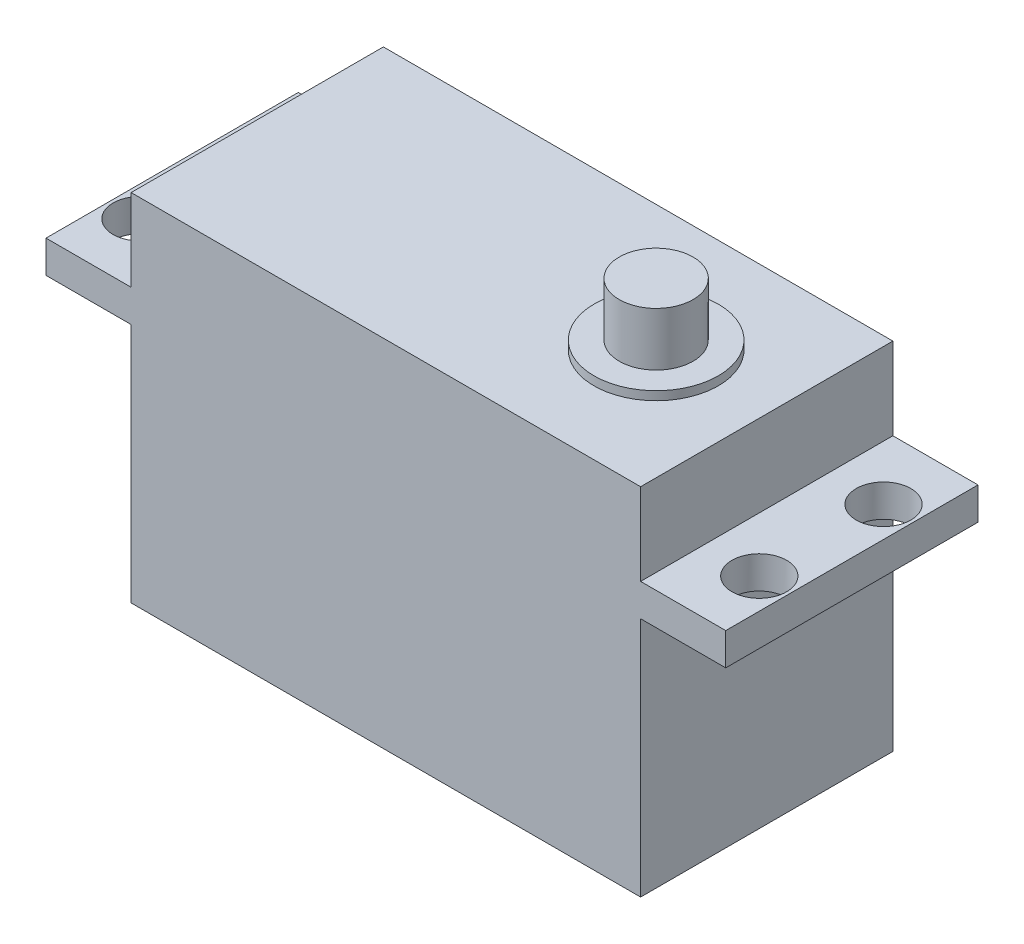
ISO-10303-21;
HEADER;
FILE_DESCRIPTION(('STEP AP214'),'2;1');
FILE_NAME('part.step','',(''),(''),'','','');
FILE_SCHEMA(('AUTOMOTIVE_DESIGN { 1 0 10303 214 1 1 1 1 }'));
ENDSEC;
DATA;
#1=APPLICATION_CONTEXT('core data for automotive mechanical design processes');
#2=APPLICATION_PROTOCOL_DEFINITION('international standard','automotive_design',2000,#1);
#3=PRODUCT_CONTEXT('',#1,'mechanical');
#4=PRODUCT('Part','Part','',(#3));
#5=PRODUCT_RELATED_PRODUCT_CATEGORY('part','',(#4));
#6=PRODUCT_DEFINITION_FORMATION('','',#4);
#7=PRODUCT_DEFINITION_CONTEXT('part definition',#1,'design');
#8=PRODUCT_DEFINITION('design','',#6,#7);
#9=PRODUCT_DEFINITION_SHAPE('','',#8);
#10=(LENGTH_UNIT() NAMED_UNIT(*) SI_UNIT(.MILLI.,.METRE.));
#11=(NAMED_UNIT(*) PLANE_ANGLE_UNIT() SI_UNIT($,.RADIAN.));
#12=(NAMED_UNIT(*) SI_UNIT($,.STERADIAN.) SOLID_ANGLE_UNIT());
#13=UNCERTAINTY_MEASURE_WITH_UNIT(LENGTH_MEASURE(1.E-05),#10,'distance_accuracy_value','');
#14=(GEOMETRIC_REPRESENTATION_CONTEXT(3) GLOBAL_UNCERTAINTY_ASSIGNED_CONTEXT((#13)) GLOBAL_UNIT_ASSIGNED_CONTEXT((#10,
#11,#12)) REPRESENTATION_CONTEXT('',''));
#15=CARTESIAN_POINT('',(0.,0.,0.));
#16=DIRECTION('',(0.,0.,1.));
#17=DIRECTION('',(1.,0.,0.));
#18=AXIS2_PLACEMENT_3D('',#15,#16,#17);
#19=CARTESIAN_POINT('',(0.,2.6,0.));
#20=DIRECTION('',(0.,-1.,0.));
#21=DIRECTION('',(0.,0.,-1.));
#22=AXIS2_PLACEMENT_3D('',#19,#20,#21);
#23=PLANE('',#22);
#24=CARTESIAN_POINT('',(-4.4,2.6,5.15));
#25=DIRECTION('',(0.,1.,0.));
#26=DIRECTION('',(0.,0.,1.));
#27=AXIS2_PLACEMENT_3D('',#24,#25,#26);
#28=CIRCLE('',#27,2.2);
#29=CARTESIAN_POINT('',(-4.4,2.6,7.35));
#30=VERTEX_POINT('',#29);
#31=EDGE_CURVE('E215',#30,#30,#28,.T.);
#32=ORIENTED_EDGE('',*,*,#31,.F.);
#33=EDGE_LOOP('',(#32));
#34=FACE_BOUND('',#33,.T.);
#35=CARTESIAN_POINT('',(-4.4,2.6,15.15));
#36=DIRECTION('',(0.,1.,0.));
#37=DIRECTION('',(0.,0.,1.));
#38=AXIS2_PLACEMENT_3D('',#35,#36,#37);
#39=CIRCLE('',#38,2.2);
#40=CARTESIAN_POINT('',(-4.4,2.6,17.35));
#41=VERTEX_POINT('',#40);
#42=EDGE_CURVE('E210',#41,#41,#39,.T.);
#43=ORIENTED_EDGE('',*,*,#42,.F.);
#44=EDGE_LOOP('',(#43));
#45=FACE_BOUND('',#44,.T.);
#46=DIRECTION('',(0.,0.,1.));
#47=VECTOR('',#46,1.);
#48=CARTESIAN_POINT('',(0.,2.6,20.3));
#49=LINE('',#48,#47);
#50=CARTESIAN_POINT('',(0.,2.6,0.));
#51=VERTEX_POINT('',#50);
#52=CARTESIAN_POINT('',(0.,2.6,20.3));
#53=VERTEX_POINT('',#52);
#54=EDGE_CURVE('E47',#51,#53,#49,.T.);
#55=ORIENTED_EDGE('',*,*,#54,.F.);
#56=DIRECTION('',(-1.,0.,0.));
#57=VECTOR('',#56,1.);
#58=CARTESIAN_POINT('',(-6.85,2.6,0.));
#59=LINE('',#58,#57);
#60=CARTESIAN_POINT('',(-6.85,2.6,0.));
#61=VERTEX_POINT('',#60);
#62=EDGE_CURVE('E161',#51,#61,#59,.T.);
#63=ORIENTED_EDGE('',*,*,#62,.T.);
#64=DIRECTION('',(0.,0.,1.));
#65=VECTOR('',#64,1.);
#66=CARTESIAN_POINT('',(-6.85,2.6,20.3));
#67=LINE('',#66,#65);
#68=CARTESIAN_POINT('',(-6.85,2.6,20.3));
#69=VERTEX_POINT('',#68);
#70=EDGE_CURVE('E152',#61,#69,#67,.T.);
#71=ORIENTED_EDGE('',*,*,#70,.T.);
#72=DIRECTION('',(1.,0.,0.));
#73=VECTOR('',#72,1.);
#74=CARTESIAN_POINT('',(-6.85,2.6,20.3));
#75=LINE('',#74,#73);
#76=EDGE_CURVE('E157',#69,#53,#75,.T.);
#77=ORIENTED_EDGE('',*,*,#76,.T.);
#78=EDGE_LOOP('',(#55,#63,#71,#77));
#79=FACE_BOUND('',#78,.T.);
#80=ADVANCED_FACE('F32',(#34,#45,#79),#23,.F.);
#81=CARTESIAN_POINT('',(45.4,2.6,15.15));
#82=DIRECTION('',(0.,1.,0.));
#83=DIRECTION('',(0.,0.,1.));
#84=AXIS2_PLACEMENT_3D('',#81,#82,#83);
#85=CIRCLE('',#84,2.2);
#86=CARTESIAN_POINT('',(45.4,2.6,17.35));
#87=VERTEX_POINT('',#86);
#88=EDGE_CURVE('E361',#87,#87,#85,.T.);
#89=ORIENTED_EDGE('',*,*,#88,.F.);
#90=EDGE_LOOP('',(#89));
#91=FACE_BOUND('',#90,.T.);
#92=CARTESIAN_POINT('',(45.4,2.6,5.15));
#93=DIRECTION('',(0.,1.,0.));
#94=DIRECTION('',(0.,0.,1.));
#95=AXIS2_PLACEMENT_3D('',#92,#93,#94);
#96=CIRCLE('',#95,2.2);
#97=CARTESIAN_POINT('',(45.4,2.6,7.35));
#98=VERTEX_POINT('',#97);
#99=EDGE_CURVE('E226',#98,#98,#96,.T.);
#100=ORIENTED_EDGE('',*,*,#99,.F.);
#101=EDGE_LOOP('',(#100));
#102=FACE_BOUND('',#101,.T.);
#103=DIRECTION('',(0.,0.,-1.));
#104=VECTOR('',#103,1.);
#105=CARTESIAN_POINT('',(41.,2.6,20.3));
#106=LINE('',#105,#104);
#107=CARTESIAN_POINT('',(41.,2.6,20.3));
#108=VERTEX_POINT('',#107);
#109=CARTESIAN_POINT('',(41.,2.6,0.));
#110=VERTEX_POINT('',#109);
#111=EDGE_CURVE('E55',#108,#110,#106,.T.);
#112=ORIENTED_EDGE('',*,*,#111,.F.);
#113=CARTESIAN_POINT('',(47.85,2.6,20.3));
#114=VERTEX_POINT('',#113);
#115=EDGE_CURVE('E155',#108,#114,#75,.T.);
#116=ORIENTED_EDGE('',*,*,#115,.T.);
#117=DIRECTION('',(0.,0.,-1.));
#118=VECTOR('',#117,1.);
#119=CARTESIAN_POINT('',(47.85,2.6,20.3));
#120=LINE('',#119,#118);
#121=CARTESIAN_POINT('',(47.85,2.6,0.));
#122=VERTEX_POINT('',#121);
#123=EDGE_CURVE('E159',#114,#122,#120,.T.);
#124=ORIENTED_EDGE('',*,*,#123,.T.);
#125=EDGE_CURVE('E162',#122,#110,#59,.T.);
#126=ORIENTED_EDGE('',*,*,#125,.T.);
#127=EDGE_LOOP('',(#112,#116,#124,#126));
#128=FACE_BOUND('',#127,.T.);
#129=ADVANCED_FACE('F254',(#91,#102,#128),#23,.F.);
#130=CARTESIAN_POINT('',(0.,0.,20.3));
#131=DIRECTION('',(1.,0.,0.));
#132=DIRECTION('',(0.,1.,0.));
#133=AXIS2_PLACEMENT_3D('',#130,#131,#132);
#134=PLANE('',#133);
#135=DIRECTION('',(0.,-1.,0.));
#136=VECTOR('',#135,1.);
#137=CARTESIAN_POINT('',(0.,0.,0.));
#138=LINE('',#137,#136);
#139=CARTESIAN_POINT('',(0.,0.,0.));
#140=VERTEX_POINT('',#139);
#141=CARTESIAN_POINT('',(0.,-19.4,0.));
#142=VERTEX_POINT('',#141);
#143=EDGE_CURVE('E184',#140,#142,#138,.T.);
#144=ORIENTED_EDGE('',*,*,#143,.T.);
#145=DIRECTION('',(0.,0.,-1.));
#146=VECTOR('',#145,1.);
#147=CARTESIAN_POINT('',(0.,-19.4,20.3));
#148=LINE('',#147,#146);
#149=CARTESIAN_POINT('',(0.,-19.4,20.3));
#150=VERTEX_POINT('',#149);
#151=EDGE_CURVE('E40',#150,#142,#148,.T.);
#152=ORIENTED_EDGE('',*,*,#151,.F.);
#153=DIRECTION('',(0.,-1.,0.));
#154=VECTOR('',#153,1.);
#155=CARTESIAN_POINT('',(0.,0.,20.3));
#156=LINE('',#155,#154);
#157=CARTESIAN_POINT('',(0.,0.,20.3));
#158=VERTEX_POINT('',#157);
#159=EDGE_CURVE('E185',#158,#150,#156,.T.);
#160=ORIENTED_EDGE('',*,*,#159,.F.);
#161=DIRECTION('',(0.,0.,-1.));
#162=VECTOR('',#161,1.);
#163=CARTESIAN_POINT('',(0.,0.,20.3));
#164=LINE('',#163,#162);
#165=EDGE_CURVE('E192',#158,#140,#164,.T.);
#166=ORIENTED_EDGE('',*,*,#165,.T.);
#167=EDGE_LOOP('',(#144,#152,#160,#166));
#168=FACE_BOUND('',#167,.T.);
#169=ADVANCED_FACE('F34',(#168),#134,.F.);
#170=CARTESIAN_POINT('',(0.,-19.4,20.3));
#171=DIRECTION('',(0.,1.,0.));
#172=DIRECTION('',(0.,0.,1.));
#173=AXIS2_PLACEMENT_3D('',#170,#171,#172);
#174=PLANE('',#173);
#175=DIRECTION('',(1.,0.,0.));
#176=VECTOR('',#175,1.);
#177=CARTESIAN_POINT('',(0.,-19.4,0.));
#178=LINE('',#177,#176);
#179=CARTESIAN_POINT('',(41.,-19.4,0.));
#180=VERTEX_POINT('',#179);
#181=EDGE_CURVE('E195',#142,#180,#178,.T.);
#182=ORIENTED_EDGE('',*,*,#181,.T.);
#183=DIRECTION('',(0.,0.,-1.));
#184=VECTOR('',#183,1.);
#185=CARTESIAN_POINT('',(41.,-19.4,20.3));
#186=LINE('',#185,#184);
#187=CARTESIAN_POINT('',(41.,-19.4,20.3));
#188=VERTEX_POINT('',#187);
#189=EDGE_CURVE('E202',#188,#180,#186,.T.);
#190=ORIENTED_EDGE('',*,*,#189,.F.);
#191=DIRECTION('',(1.,0.,0.));
#192=VECTOR('',#191,1.);
#193=CARTESIAN_POINT('',(0.,-19.4,20.3));
#194=LINE('',#193,#192);
#195=EDGE_CURVE('E187',#150,#188,#194,.T.);
#196=ORIENTED_EDGE('',*,*,#195,.F.);
#197=ORIENTED_EDGE('',*,*,#151,.T.);
#198=EDGE_LOOP('',(#182,#190,#196,#197));
#199=FACE_BOUND('',#198,.T.);
#200=ADVANCED_FACE('F282',(#199),#174,.F.);
#201=CARTESIAN_POINT('',(41.,0.,20.3));
#202=DIRECTION('',(-1.,0.,0.));
#203=DIRECTION('',(0.,-1.,0.));
#204=AXIS2_PLACEMENT_3D('',#201,#202,#203);
#205=PLANE('',#204);
#206=DIRECTION('',(0.,1.,0.));
#207=VECTOR('',#206,1.);
#208=CARTESIAN_POINT('',(41.,0.,0.));
#209=LINE('',#208,#207);
#210=CARTESIAN_POINT('',(41.,0.,0.));
#211=VERTEX_POINT('',#210);
#212=EDGE_CURVE('E188',#180,#211,#209,.T.);
#213=ORIENTED_EDGE('',*,*,#212,.T.);
#214=DIRECTION('',(0.,0.,-1.));
#215=VECTOR('',#214,1.);
#216=CARTESIAN_POINT('',(41.,0.,20.3));
#217=LINE('',#216,#215);
#218=CARTESIAN_POINT('',(41.,0.,20.3));
#219=VERTEX_POINT('',#218);
#220=EDGE_CURVE('E199',#219,#211,#217,.T.);
#221=ORIENTED_EDGE('',*,*,#220,.F.);
#222=DIRECTION('',(0.,1.,0.));
#223=VECTOR('',#222,1.);
#224=CARTESIAN_POINT('',(41.,0.,20.3));
#225=LINE('',#224,#223);
#226=EDGE_CURVE('E190',#188,#219,#225,.T.);
#227=ORIENTED_EDGE('',*,*,#226,.F.);
#228=ORIENTED_EDGE('',*,*,#189,.T.);
#229=EDGE_LOOP('',(#213,#221,#227,#228));
#230=FACE_BOUND('',#229,.T.);
#231=ADVANCED_FACE('F278',(#230),#205,.F.);
#232=CARTESIAN_POINT('',(0.,0.,20.3));
#233=DIRECTION('',(0.,0.,1.));
#234=DIRECTION('',(1.,0.,0.));
#235=AXIS2_PLACEMENT_3D('',#232,#233,#234);
#236=PLANE('',#235);
#237=ORIENTED_EDGE('',*,*,#159,.T.);
#238=ORIENTED_EDGE('',*,*,#195,.T.);
#239=ORIENTED_EDGE('',*,*,#226,.T.);
#240=DIRECTION('',(1.,0.,0.));
#241=VECTOR('',#240,1.);
#242=CARTESIAN_POINT('',(-6.85,0.,20.3));
#243=LINE('',#242,#241);
#244=CARTESIAN_POINT('',(47.85,0.,20.3));
#245=VERTEX_POINT('',#244);
#246=EDGE_CURVE('E146',#219,#245,#243,.T.);
#247=ORIENTED_EDGE('',*,*,#246,.T.);
#248=DIRECTION('',(0.,-1.,0.));
#249=VECTOR('',#248,1.);
#250=CARTESIAN_POINT('',(47.85,2.6,20.3));
#251=LINE('',#250,#249);
#252=EDGE_CURVE('E178',#114,#245,#251,.T.);
#253=ORIENTED_EDGE('',*,*,#252,.F.);
#254=ORIENTED_EDGE('',*,*,#115,.F.);
#255=DIRECTION('',(0.,-1.,0.));
#256=VECTOR('',#255,1.);
#257=CARTESIAN_POINT('',(41.,9.2,20.3));
#258=LINE('',#257,#256);
#259=CARTESIAN_POINT('',(41.,9.2,20.3));
#260=VERTEX_POINT('',#259);
#261=EDGE_CURVE('E128',#260,#108,#258,.T.);
#262=ORIENTED_EDGE('',*,*,#261,.F.);
#263=DIRECTION('',(1.,0.,0.));
#264=VECTOR('',#263,1.);
#265=CARTESIAN_POINT('',(0.,9.2,20.3));
#266=LINE('',#265,#264);
#267=CARTESIAN_POINT('',(0.,9.2,20.3));
#268=VERTEX_POINT('',#267);
#269=EDGE_CURVE('E121',#268,#260,#266,.T.);
#270=ORIENTED_EDGE('',*,*,#269,.F.);
#271=DIRECTION('',(0.,-1.,0.));
#272=VECTOR('',#271,1.);
#273=CARTESIAN_POINT('',(0.,9.2,20.3));
#274=LINE('',#273,#272);
#275=EDGE_CURVE('E126',#268,#53,#274,.T.);
#276=ORIENTED_EDGE('',*,*,#275,.T.);
#277=ORIENTED_EDGE('',*,*,#76,.F.);
#278=DIRECTION('',(0.,-1.,0.));
#279=VECTOR('',#278,1.);
#280=CARTESIAN_POINT('',(-6.85,2.6,20.3));
#281=LINE('',#280,#279);
#282=CARTESIAN_POINT('',(-6.85,0.,20.3));
#283=VERTEX_POINT('',#282);
#284=EDGE_CURVE('E181',#69,#283,#281,.T.);
#285=ORIENTED_EDGE('',*,*,#284,.T.);
#286=EDGE_CURVE('E165',#283,#158,#243,.T.);
#287=ORIENTED_EDGE('',*,*,#286,.T.);
#288=EDGE_LOOP('',(#237,#238,#239,#247,#253,#254,#262,#270,#276,#277,#285,#287));
#289=FACE_BOUND('',#288,.T.);
#290=ADVANCED_FACE('F124',(#289),#236,.T.);
#291=CARTESIAN_POINT('',(0.,0.,0.));
#292=DIRECTION('',(0.,0.,1.));
#293=DIRECTION('',(1.,0.,0.));
#294=AXIS2_PLACEMENT_3D('',#291,#292,#293);
#295=PLANE('',#294);
#296=ORIENTED_EDGE('',*,*,#143,.F.);
#297=DIRECTION('',(-1.,0.,0.));
#298=VECTOR('',#297,1.);
#299=CARTESIAN_POINT('',(-6.85,0.,0.));
#300=LINE('',#299,#298);
#301=CARTESIAN_POINT('',(-6.85,0.,0.));
#302=VERTEX_POINT('',#301);
#303=EDGE_CURVE('E170',#140,#302,#300,.T.);
#304=ORIENTED_EDGE('',*,*,#303,.T.);
#305=DIRECTION('',(0.,-1.,0.));
#306=VECTOR('',#305,1.);
#307=CARTESIAN_POINT('',(-6.85,2.6,0.));
#308=LINE('',#307,#306);
#309=EDGE_CURVE('E163',#61,#302,#308,.T.);
#310=ORIENTED_EDGE('',*,*,#309,.F.);
#311=ORIENTED_EDGE('',*,*,#62,.F.);
#312=DIRECTION('',(0.,-1.,0.));
#313=VECTOR('',#312,1.);
#314=CARTESIAN_POINT('',(0.,9.2,0.));
#315=LINE('',#314,#313);
#316=CARTESIAN_POINT('',(0.,9.2,0.));
#317=VERTEX_POINT('',#316);
#318=EDGE_CURVE('E231',#317,#51,#315,.T.);
#319=ORIENTED_EDGE('',*,*,#318,.F.);
#320=DIRECTION('',(-1.,0.,0.));
#321=VECTOR('',#320,1.);
#322=CARTESIAN_POINT('',(0.,9.2,0.));
#323=LINE('',#322,#321);
#324=CARTESIAN_POINT('',(41.,9.2,0.));
#325=VERTEX_POINT('',#324);
#326=EDGE_CURVE('E137',#325,#317,#323,.T.);
#327=ORIENTED_EDGE('',*,*,#326,.F.);
#328=DIRECTION('',(0.,-1.,0.));
#329=VECTOR('',#328,1.);
#330=CARTESIAN_POINT('',(41.,9.2,0.));
#331=LINE('',#330,#329);
#332=EDGE_CURVE('E148',#325,#110,#331,.T.);
#333=ORIENTED_EDGE('',*,*,#332,.T.);
#334=ORIENTED_EDGE('',*,*,#125,.F.);
#335=DIRECTION('',(0.,-1.,0.));
#336=VECTOR('',#335,1.);
#337=CARTESIAN_POINT('',(47.85,2.6,0.));
#338=LINE('',#337,#336);
#339=CARTESIAN_POINT('',(47.85,0.,0.));
#340=VERTEX_POINT('',#339);
#341=EDGE_CURVE('E175',#122,#340,#338,.T.);
#342=ORIENTED_EDGE('',*,*,#341,.T.);
#343=EDGE_CURVE('E156',#340,#211,#300,.T.);
#344=ORIENTED_EDGE('',*,*,#343,.T.);
#345=ORIENTED_EDGE('',*,*,#212,.F.);
#346=ORIENTED_EDGE('',*,*,#181,.F.);
#347=EDGE_LOOP('',(#296,#304,#310,#311,#319,#327,#333,#334,#342,#344,#345,#346));
#348=FACE_BOUND('',#347,.T.);
#349=ADVANCED_FACE('F239',(#348),#295,.F.);
#350=CARTESIAN_POINT('',(0.,0.,0.));
#351=DIRECTION('',(0.,-1.,0.));
#352=DIRECTION('',(0.,0.,-1.));
#353=AXIS2_PLACEMENT_3D('',#350,#351,#352);
#354=PLANE('',#353);
#355=CARTESIAN_POINT('',(-4.4,0.,5.15));
#356=DIRECTION('',(0.,-1.,0.));
#357=DIRECTION('',(0.,0.,-1.));
#358=AXIS2_PLACEMENT_3D('',#355,#356,#357);
#359=CIRCLE('',#358,2.2);
#360=CARTESIAN_POINT('',(-4.4,0.,2.95));
#361=VERTEX_POINT('',#360);
#362=EDGE_CURVE('E217',#361,#361,#359,.T.);
#363=ORIENTED_EDGE('',*,*,#362,.F.);
#364=EDGE_LOOP('',(#363));
#365=FACE_BOUND('',#364,.T.);
#366=CARTESIAN_POINT('',(-4.4,0.,15.15));
#367=DIRECTION('',(0.,-1.,0.));
#368=DIRECTION('',(0.,0.,-1.));
#369=AXIS2_PLACEMENT_3D('',#366,#367,#368);
#370=CIRCLE('',#369,2.2);
#371=CARTESIAN_POINT('',(-4.4,0.,12.95));
#372=VERTEX_POINT('',#371);
#373=EDGE_CURVE('E207',#372,#372,#370,.T.);
#374=ORIENTED_EDGE('',*,*,#373,.F.);
#375=EDGE_LOOP('',(#374));
#376=FACE_BOUND('',#375,.T.);
#377=ORIENTED_EDGE('',*,*,#165,.F.);
#378=ORIENTED_EDGE('',*,*,#286,.F.);
#379=DIRECTION('',(0.,0.,1.));
#380=VECTOR('',#379,1.);
#381=CARTESIAN_POINT('',(-6.85,0.,20.3));
#382=LINE('',#381,#380);
#383=EDGE_CURVE('E143',#302,#283,#382,.T.);
#384=ORIENTED_EDGE('',*,*,#383,.F.);
#385=ORIENTED_EDGE('',*,*,#303,.F.);
#386=EDGE_LOOP('',(#377,#378,#384,#385));
#387=FACE_BOUND('',#386,.T.);
#388=ADVANCED_FACE('F268',(#365,#376,#387),#354,.T.);
#389=CARTESIAN_POINT('',(-6.85,2.6,20.3));
#390=DIRECTION('',(1.,0.,0.));
#391=DIRECTION('',(0.,0.,-1.));
#392=AXIS2_PLACEMENT_3D('',#389,#390,#391);
#393=PLANE('',#392);
#394=ORIENTED_EDGE('',*,*,#383,.T.);
#395=ORIENTED_EDGE('',*,*,#284,.F.);
#396=ORIENTED_EDGE('',*,*,#70,.F.);
#397=ORIENTED_EDGE('',*,*,#309,.T.);
#398=EDGE_LOOP('',(#394,#395,#396,#397));
#399=FACE_BOUND('',#398,.T.);
#400=ADVANCED_FACE('F271',(#399),#393,.F.);
#401=CARTESIAN_POINT('',(47.85,2.6,20.3));
#402=DIRECTION('',(-1.,0.,0.));
#403=DIRECTION('',(0.,0.,1.));
#404=AXIS2_PLACEMENT_3D('',#401,#402,#403);
#405=PLANE('',#404);
#406=DIRECTION('',(0.,0.,-1.));
#407=VECTOR('',#406,1.);
#408=CARTESIAN_POINT('',(47.85,0.,20.3));
#409=LINE('',#408,#407);
#410=EDGE_CURVE('E168',#245,#340,#409,.T.);
#411=ORIENTED_EDGE('',*,*,#410,.T.);
#412=ORIENTED_EDGE('',*,*,#341,.F.);
#413=ORIENTED_EDGE('',*,*,#123,.F.);
#414=ORIENTED_EDGE('',*,*,#252,.T.);
#415=EDGE_LOOP('',(#411,#412,#413,#414));
#416=FACE_BOUND('',#415,.T.);
#417=ADVANCED_FACE('F266',(#416),#405,.F.);
#418=CARTESIAN_POINT('',(45.4,0.,15.15));
#419=DIRECTION('',(0.,-1.,0.));
#420=DIRECTION('',(0.,0.,-1.));
#421=AXIS2_PLACEMENT_3D('',#418,#419,#420);
#422=CIRCLE('',#421,2.2);
#423=CARTESIAN_POINT('',(45.4,0.,12.95));
#424=VERTEX_POINT('',#423);
#425=EDGE_CURVE('E214',#424,#424,#422,.T.);
#426=ORIENTED_EDGE('',*,*,#425,.F.);
#427=EDGE_LOOP('',(#426));
#428=FACE_BOUND('',#427,.T.);
#429=CARTESIAN_POINT('',(45.4,0.,5.15));
#430=DIRECTION('',(0.,-1.,0.));
#431=DIRECTION('',(0.,0.,-1.));
#432=AXIS2_PLACEMENT_3D('',#429,#430,#431);
#433=CIRCLE('',#432,2.2);
#434=CARTESIAN_POINT('',(45.4,0.,2.95));
#435=VERTEX_POINT('',#434);
#436=EDGE_CURVE('E211',#435,#435,#433,.T.);
#437=ORIENTED_EDGE('',*,*,#436,.F.);
#438=EDGE_LOOP('',(#437));
#439=FACE_BOUND('',#438,.T.);
#440=ORIENTED_EDGE('',*,*,#246,.F.);
#441=ORIENTED_EDGE('',*,*,#220,.T.);
#442=ORIENTED_EDGE('',*,*,#343,.F.);
#443=ORIENTED_EDGE('',*,*,#410,.F.);
#444=EDGE_LOOP('',(#440,#441,#442,#443));
#445=FACE_BOUND('',#444,.T.);
#446=ADVANCED_FACE('F251',(#428,#439,#445),#354,.T.);
#447=CARTESIAN_POINT('',(0.,9.2,20.3));
#448=DIRECTION('',(1.,0.,0.));
#449=DIRECTION('',(0.,0.,-1.));
#450=AXIS2_PLACEMENT_3D('',#447,#448,#449);
#451=PLANE('',#450);
#452=ORIENTED_EDGE('',*,*,#54,.T.);
#453=ORIENTED_EDGE('',*,*,#275,.F.);
#454=DIRECTION('',(0.,0.,1.));
#455=VECTOR('',#454,1.);
#456=CARTESIAN_POINT('',(0.,9.2,20.3));
#457=LINE('',#456,#455);
#458=EDGE_CURVE('E132',#317,#268,#457,.T.);
#459=ORIENTED_EDGE('',*,*,#458,.F.);
#460=ORIENTED_EDGE('',*,*,#318,.T.);
#461=EDGE_LOOP('',(#452,#453,#459,#460));
#462=FACE_BOUND('',#461,.T.);
#463=ADVANCED_FACE('F142',(#462),#451,.F.);
#464=CARTESIAN_POINT('',(41.,9.2,20.3));
#465=DIRECTION('',(-1.,0.,0.));
#466=DIRECTION('',(0.,0.,1.));
#467=AXIS2_PLACEMENT_3D('',#464,#465,#466);
#468=PLANE('',#467);
#469=ORIENTED_EDGE('',*,*,#111,.T.);
#470=ORIENTED_EDGE('',*,*,#332,.F.);
#471=DIRECTION('',(0.,0.,-1.));
#472=VECTOR('',#471,1.);
#473=CARTESIAN_POINT('',(41.,9.2,20.3));
#474=LINE('',#473,#472);
#475=EDGE_CURVE('E131',#260,#325,#474,.T.);
#476=ORIENTED_EDGE('',*,*,#475,.F.);
#477=ORIENTED_EDGE('',*,*,#261,.T.);
#478=EDGE_LOOP('',(#469,#470,#476,#477));
#479=FACE_BOUND('',#478,.T.);
#480=ADVANCED_FACE('F241',(#479),#468,.F.);
#481=CARTESIAN_POINT('',(0.,9.2,0.));
#482=DIRECTION('',(0.,-1.,0.));
#483=DIRECTION('',(0.,0.,-1.));
#484=AXIS2_PLACEMENT_3D('',#481,#482,#483);
#485=PLANE('',#484);
#486=CARTESIAN_POINT('',(32.1,9.2,10.15));
#487=DIRECTION('',(0.,-1.,0.));
#488=DIRECTION('',(0.,0.,-1.));
#489=AXIS2_PLACEMENT_3D('',#486,#487,#488);
#490=CIRCLE('',#489,5.);
#491=CARTESIAN_POINT('',(32.1,9.2,5.15));
#492=VERTEX_POINT('',#491);
#493=EDGE_CURVE('E11',#492,#492,#490,.F.);
#494=ORIENTED_EDGE('',*,*,#493,.F.);
#495=EDGE_LOOP('',(#494));
#496=FACE_BOUND('',#495,.T.);
#497=ORIENTED_EDGE('',*,*,#458,.T.);
#498=ORIENTED_EDGE('',*,*,#269,.T.);
#499=ORIENTED_EDGE('',*,*,#475,.T.);
#500=ORIENTED_EDGE('',*,*,#326,.T.);
#501=EDGE_LOOP('',(#497,#498,#499,#500));
#502=FACE_BOUND('',#501,.T.);
#503=ADVANCED_FACE('F135',(#496,#502),#485,.F.);
#504=CARTESIAN_POINT('',(-4.4,-19.4,15.15));
#505=DIRECTION('',(0.,1.,0.));
#506=DIRECTION('',(0.,0.,1.));
#507=AXIS2_PLACEMENT_3D('',#504,#505,#506);
#508=CYLINDRICAL_SURFACE('',#507,2.2);
#509=ORIENTED_EDGE('',*,*,#373,.T.);
#510=EDGE_LOOP('',(#509));
#511=FACE_BOUND('',#510,.T.);
#512=ORIENTED_EDGE('',*,*,#42,.T.);
#513=EDGE_LOOP('',(#512));
#514=FACE_BOUND('',#513,.T.);
#515=ADVANCED_FACE('F248',(#511,#514),#508,.F.);
#516=CARTESIAN_POINT('',(45.4,-19.4,5.15));
#517=DIRECTION('',(0.,1.,0.));
#518=DIRECTION('',(0.,0.,1.));
#519=AXIS2_PLACEMENT_3D('',#516,#517,#518);
#520=CYLINDRICAL_SURFACE('',#519,2.2);
#521=ORIENTED_EDGE('',*,*,#436,.T.);
#522=EDGE_LOOP('',(#521));
#523=FACE_BOUND('',#522,.T.);
#524=ORIENTED_EDGE('',*,*,#99,.T.);
#525=EDGE_LOOP('',(#524));
#526=FACE_BOUND('',#525,.T.);
#527=ADVANCED_FACE('F317',(#523,#526),#520,.F.);
#528=CARTESIAN_POINT('',(45.4,-19.4,15.15));
#529=DIRECTION('',(0.,1.,0.));
#530=DIRECTION('',(0.,0.,1.));
#531=AXIS2_PLACEMENT_3D('',#528,#529,#530);
#532=CYLINDRICAL_SURFACE('',#531,2.2);
#533=ORIENTED_EDGE('',*,*,#425,.T.);
#534=EDGE_LOOP('',(#533));
#535=FACE_BOUND('',#534,.T.);
#536=ORIENTED_EDGE('',*,*,#88,.T.);
#537=EDGE_LOOP('',(#536));
#538=FACE_BOUND('',#537,.T.);
#539=ADVANCED_FACE('F322',(#535,#538),#532,.F.);
#540=CARTESIAN_POINT('',(-4.4,-19.4,5.15));
#541=DIRECTION('',(0.,1.,0.));
#542=DIRECTION('',(0.,0.,1.));
#543=AXIS2_PLACEMENT_3D('',#540,#541,#542);
#544=CYLINDRICAL_SURFACE('',#543,2.2);
#545=ORIENTED_EDGE('',*,*,#362,.T.);
#546=EDGE_LOOP('',(#545));
#547=FACE_BOUND('',#546,.T.);
#548=ORIENTED_EDGE('',*,*,#31,.T.);
#549=EDGE_LOOP('',(#548));
#550=FACE_BOUND('',#549,.T.);
#551=ADVANCED_FACE('F328',(#547,#550),#544,.F.);
#552=CARTESIAN_POINT('',(32.1,9.9,10.15));
#553=DIRECTION('',(0.,-1.,0.));
#554=DIRECTION('',(0.,0.,-1.));
#555=AXIS2_PLACEMENT_3D('',#552,#553,#554);
#556=CYLINDRICAL_SURFACE('',#555,5.);
#557=CARTESIAN_POINT('',(32.1,9.9,10.15));
#558=DIRECTION('',(0.,1.,0.));
#559=DIRECTION('',(0.,0.,1.));
#560=AXIS2_PLACEMENT_3D('',#557,#558,#559);
#561=CIRCLE('',#560,5.);
#562=CARTESIAN_POINT('',(32.1,9.9,15.15));
#563=VERTEX_POINT('',#562);
#564=EDGE_CURVE('E352',#563,#563,#561,.T.);
#565=ORIENTED_EDGE('',*,*,#564,.F.);
#566=EDGE_LOOP('',(#565));
#567=FACE_BOUND('',#566,.T.);
#568=ORIENTED_EDGE('',*,*,#493,.T.);
#569=EDGE_LOOP('',(#568));
#570=FACE_BOUND('',#569,.T.);
#571=ADVANCED_FACE('F332',(#567,#570),#556,.T.);
#572=CARTESIAN_POINT('',(32.1,9.9,10.15));
#573=DIRECTION('',(0.,1.,0.));
#574=DIRECTION('',(0.,0.,1.));
#575=AXIS2_PLACEMENT_3D('',#572,#573,#574);
#576=PLANE('',#575);
#577=CARTESIAN_POINT('',(32.1,9.9,10.15));
#578=DIRECTION('',(0.,1.,0.));
#579=DIRECTION('',(0.,0.,1.));
#580=AXIS2_PLACEMENT_3D('',#577,#578,#579);
#581=CIRCLE('',#580,2.97);
#582=CARTESIAN_POINT('',(32.1,9.9,7.18));
#583=VERTEX_POINT('',#582);
#584=EDGE_CURVE('E353',#583,#583,#581,.T.);
#585=ORIENTED_EDGE('',*,*,#584,.F.);
#586=EDGE_LOOP('',(#585));
#587=FACE_BOUND('',#586,.T.);
#588=ORIENTED_EDGE('',*,*,#564,.T.);
#589=EDGE_LOOP('',(#588));
#590=FACE_BOUND('',#589,.T.);
#591=ADVANCED_FACE('F335',(#587,#590),#576,.T.);
#592=CARTESIAN_POINT('',(32.1,14.2,10.15));
#593=DIRECTION('',(0.,-1.,0.));
#594=DIRECTION('',(0.,0.,-1.));
#595=AXIS2_PLACEMENT_3D('',#592,#593,#594);
#596=CYLINDRICAL_SURFACE('',#595,2.97);
#597=CARTESIAN_POINT('',(32.1,14.2,10.15));
#598=DIRECTION('',(0.,1.,0.));
#599=DIRECTION('',(0.,0.,1.));
#600=AXIS2_PLACEMENT_3D('',#597,#598,#599);
#601=CIRCLE('',#600,2.97);
#602=CARTESIAN_POINT('',(32.1,14.2,7.18));
#603=VERTEX_POINT('',#602);
#604=EDGE_CURVE('E351',#603,#603,#601,.T.);
#605=CARTESIAN_POINT('',(32.1,14.2,7.18));
#606=CARTESIAN_POINT('',(32.1,14.1552083333333,7.18));
#607=CARTESIAN_POINT('',(32.1,14.1104166666667,7.18));
#608=CARTESIAN_POINT('',(32.1,14.0208333333333,7.18));
#609=CARTESIAN_POINT('',(32.1,13.9760416666667,7.18));
#610=CARTESIAN_POINT('',(32.1,13.8864583333333,7.18));
#611=CARTESIAN_POINT('',(32.1,13.8416666666667,7.18));
#612=CARTESIAN_POINT('',(32.1,13.7520833333333,7.18));
#613=CARTESIAN_POINT('',(32.1,13.7072916666667,7.18));
#614=CARTESIAN_POINT('',(32.1,13.6177083333333,7.18));
#615=CARTESIAN_POINT('',(32.1,13.5729166666667,7.18));
#616=CARTESIAN_POINT('',(32.1,13.4833333333333,7.18));
#617=CARTESIAN_POINT('',(32.1,13.4385416666667,7.18));
#618=CARTESIAN_POINT('',(32.1,13.3489583333333,7.18));
#619=CARTESIAN_POINT('',(32.1,13.3041666666667,7.18));
#620=CARTESIAN_POINT('',(32.1,13.2145833333333,7.18));
#621=CARTESIAN_POINT('',(32.1,13.1697916666667,7.18));
#622=CARTESIAN_POINT('',(32.1,13.0802083333333,7.18));
#623=CARTESIAN_POINT('',(32.1,13.0354166666667,7.18));
#624=CARTESIAN_POINT('',(32.1,12.9458333333333,7.18));
#625=CARTESIAN_POINT('',(32.1,12.9010416666667,7.18));
#626=CARTESIAN_POINT('',(32.1,12.8114583333333,7.18));
#627=CARTESIAN_POINT('',(32.1,12.7666666666667,7.18));
#628=CARTESIAN_POINT('',(32.1,12.6770833333333,7.18));
#629=CARTESIAN_POINT('',(32.1,12.6322916666667,7.18));
#630=CARTESIAN_POINT('',(32.1,12.5427083333333,7.18));
#631=CARTESIAN_POINT('',(32.1,12.4979166666667,7.18));
#632=CARTESIAN_POINT('',(32.1,12.4083333333333,7.18));
#633=CARTESIAN_POINT('',(32.1,12.3635416666667,7.18));
#634=CARTESIAN_POINT('',(32.1,12.2739583333333,7.18));
#635=CARTESIAN_POINT('',(32.1,12.2291666666667,7.18));
#636=CARTESIAN_POINT('',(32.1,12.1395833333333,7.18));
#637=CARTESIAN_POINT('',(32.1,12.0947916666667,7.18));
#638=CARTESIAN_POINT('',(32.1,12.0052083333333,7.18));
#639=CARTESIAN_POINT('',(32.1,11.9604166666667,7.18));
#640=CARTESIAN_POINT('',(32.1,11.8708333333333,7.18));
#641=CARTESIAN_POINT('',(32.1,11.8260416666667,7.18));
#642=CARTESIAN_POINT('',(32.1,11.7364583333333,7.18));
#643=CARTESIAN_POINT('',(32.1,11.6916666666667,7.18));
#644=CARTESIAN_POINT('',(32.1,11.6020833333333,7.18));
#645=CARTESIAN_POINT('',(32.1,11.5572916666667,7.18));
#646=CARTESIAN_POINT('',(32.1,11.4677083333333,7.18));
#647=CARTESIAN_POINT('',(32.1,11.4229166666667,7.18));
#648=CARTESIAN_POINT('',(32.1,11.3333333333333,7.18));
#649=CARTESIAN_POINT('',(32.1,11.2885416666667,7.18));
#650=CARTESIAN_POINT('',(32.1,11.1989583333333,7.18));
#651=CARTESIAN_POINT('',(32.1,11.1541666666667,7.18));
#652=CARTESIAN_POINT('',(32.1,11.0645833333333,7.18));
#653=CARTESIAN_POINT('',(32.1,11.0197916666667,7.18));
#654=CARTESIAN_POINT('',(32.1,10.9302083333333,7.18));
#655=CARTESIAN_POINT('',(32.1,10.8854166666667,7.18));
#656=CARTESIAN_POINT('',(32.1,10.7958333333333,7.18));
#657=CARTESIAN_POINT('',(32.1,10.7510416666667,7.18));
#658=CARTESIAN_POINT('',(32.1,10.6614583333333,7.18));
#659=CARTESIAN_POINT('',(32.1,10.6166666666667,7.18));
#660=CARTESIAN_POINT('',(32.1,10.5270833333333,7.18));
#661=CARTESIAN_POINT('',(32.1,10.4822916666667,7.18));
#662=CARTESIAN_POINT('',(32.1,10.3927083333333,7.18));
#663=CARTESIAN_POINT('',(32.1,10.3479166666667,7.18));
#664=CARTESIAN_POINT('',(32.1,10.2583333333333,7.18));
#665=CARTESIAN_POINT('',(32.1,10.2135416666667,7.18));
#666=CARTESIAN_POINT('',(32.1,10.1239583333333,7.18));
#667=CARTESIAN_POINT('',(32.1,10.0791666666667,7.18));
#668=CARTESIAN_POINT('',(32.1,9.98958333333333,7.18));
#669=CARTESIAN_POINT('',(32.1,9.94479166666667,7.18));
#670=CARTESIAN_POINT('',(32.1,9.9,7.18));
#671=B_SPLINE_CURVE_WITH_KNOTS('',3,(#605,#606,#607,#608,#609,#610,#611,#612,#613,#614,#615,
#616,#617,#618,#619,#620,#621,#622,#623,#624,#625,#626,#627,#628,#629,#630,#631,#632,#633,#634,
#635,#636,#637,#638,#639,#640,#641,#642,#643,#644,#645,#646,#647,#648,#649,#650,#651,#652,#653,
#654,#655,#656,#657,#658,#659,#660,#661,#662,#663,#664,#665,#666,#667,#668,#669,#670),
.UNSPECIFIED.,.F.,.F.,(4,2,2,2,2,2,2,2,2,2,2,2,2,2,2,2,2,2,2,2,2,2,2,2,2,2,2,2,2,2,2,2,4),(0.,
0.134374999999999,0.26875,0.403124999999999,0.5375,0.671874999999999,0.80625,0.940624999999999,
1.075,1.209375,1.34375,1.478125,1.6125,1.746875,1.88125,2.015625,2.15,2.284375,2.41875,2.553125,
2.6875,2.821875,2.95625,3.090625,3.225,3.359375,3.49375,3.628125,3.7625,3.896875,4.03125,
4.165625,4.3),.UNSPECIFIED.);
#672=EDGE_CURVE('BSEAM339',#603,#583,#671,.T.);
#673=ORIENTED_EDGE('',*,*,#604,.F.);
#674=ORIENTED_EDGE('',*,*,#584,.T.);
#675=ORIENTED_EDGE('',*,*,#672,.T.);
#676=ORIENTED_EDGE('',*,*,#672,.F.);
#677=EDGE_LOOP('',(#673,#675,#674,#676));
#678=FACE_BOUND('',#677,.T.);
#679=ADVANCED_FACE('F339',(#678),#596,.T.);
#680=CARTESIAN_POINT('',(32.1,14.2,10.15));
#681=DIRECTION('',(0.,1.,0.));
#682=DIRECTION('',(0.,0.,1.));
#683=AXIS2_PLACEMENT_3D('',#680,#681,#682);
#684=PLANE('',#683);
#685=ORIENTED_EDGE('',*,*,#604,.T.);
#686=EDGE_LOOP('',(#685));
#687=FACE_BOUND('',#686,.T.);
#688=ADVANCED_FACE('F343',(#687),#684,.T.);
#689=CLOSED_SHELL('',(#80,#129,#169,#200,#231,#290,#349,#388,#400,#417,#446,#463,#480,#503,#515,
#527,#539,#551,#571,#591,#679,#688));
#690=MANIFOLD_SOLID_BREP('B2',#689);
#691=ADVANCED_BREP_SHAPE_REPRESENTATION('',(#18,#690),#14);
#692=SHAPE_DEFINITION_REPRESENTATION(#9,#691);
ENDSEC;
END-ISO-10303-21;
